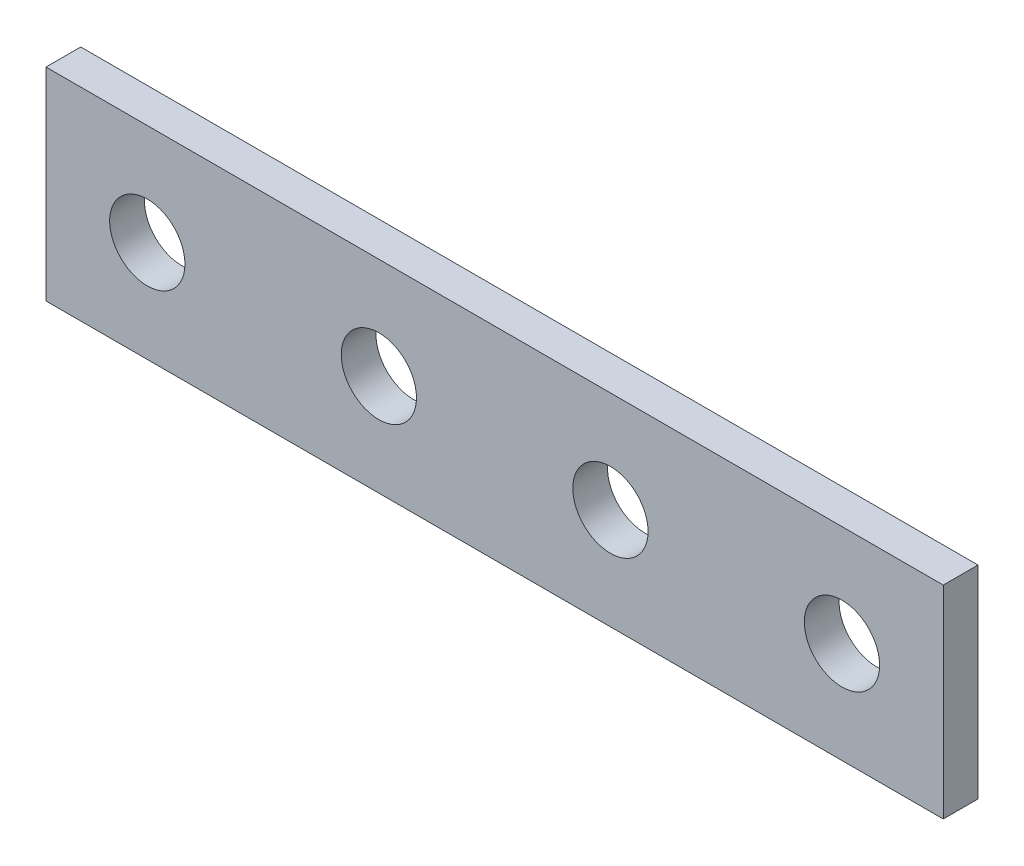
ISO-10303-21;
HEADER;
FILE_DESCRIPTION(('STEP AP214'),'2;1');
FILE_NAME('part.step','',(''),(''),'','','');
FILE_SCHEMA(('AUTOMOTIVE_DESIGN { 1 0 10303 214 1 1 1 1 }'));
ENDSEC;
DATA;
#1=APPLICATION_CONTEXT('core data for automotive mechanical design processes');
#2=APPLICATION_PROTOCOL_DEFINITION('international standard','automotive_design',2000,#1);
#3=PRODUCT_CONTEXT('',#1,'mechanical');
#4=PRODUCT('Part','Part','',(#3));
#5=PRODUCT_RELATED_PRODUCT_CATEGORY('part','',(#4));
#6=PRODUCT_DEFINITION_FORMATION('','',#4);
#7=PRODUCT_DEFINITION_CONTEXT('part definition',#1,'design');
#8=PRODUCT_DEFINITION('design','',#6,#7);
#9=PRODUCT_DEFINITION_SHAPE('','',#8);
#10=(LENGTH_UNIT() NAMED_UNIT(*) SI_UNIT(.MILLI.,.METRE.));
#11=(NAMED_UNIT(*) PLANE_ANGLE_UNIT() SI_UNIT($,.RADIAN.));
#12=(NAMED_UNIT(*) SI_UNIT($,.STERADIAN.) SOLID_ANGLE_UNIT());
#13=UNCERTAINTY_MEASURE_WITH_UNIT(LENGTH_MEASURE(1.E-05),#10,'distance_accuracy_value','');
#14=(GEOMETRIC_REPRESENTATION_CONTEXT(3) GLOBAL_UNCERTAINTY_ASSIGNED_CONTEXT((#13)) GLOBAL_UNIT_ASSIGNED_CONTEXT((#10,
#11,#12)) REPRESENTATION_CONTEXT('',''));
#15=CARTESIAN_POINT('',(0.,0.,0.));
#16=DIRECTION('',(0.,0.,1.));
#17=DIRECTION('',(1.,0.,0.));
#18=AXIS2_PLACEMENT_3D('',#15,#16,#17);
#19=CARTESIAN_POINT('',(0.,0.,12.));
#20=DIRECTION('',(0.,0.,-1.));
#21=DIRECTION('',(-1.,0.,0.));
#22=AXIS2_PLACEMENT_3D('',#19,#20,#21);
#23=PLANE('',#22);
#24=CARTESIAN_POINT('',(195.,35.,12.));
#25=DIRECTION('',(0.,0.,1.));
#26=DIRECTION('',(1.,0.,0.));
#27=AXIS2_PLACEMENT_3D('',#24,#25,#26);
#28=CIRCLE('',#27,13.);
#29=CARTESIAN_POINT('',(208.,35.,12.));
#30=VERTEX_POINT('',#29);
#31=EDGE_CURVE('E120',#30,#30,#28,.T.);
#32=ORIENTED_EDGE('',*,*,#31,.F.);
#33=EDGE_LOOP('',(#32));
#34=FACE_BOUND('',#33,.T.);
#35=CARTESIAN_POINT('',(35.,35.,12.));
#36=DIRECTION('',(0.,0.,1.));
#37=DIRECTION('',(1.,0.,0.));
#38=AXIS2_PLACEMENT_3D('',#35,#36,#37);
#39=CIRCLE('',#38,13.);
#40=CARTESIAN_POINT('',(48.,35.,12.));
#41=VERTEX_POINT('',#40);
#42=EDGE_CURVE('E99',#41,#41,#39,.T.);
#43=ORIENTED_EDGE('',*,*,#42,.F.);
#44=EDGE_LOOP('',(#43));
#45=FACE_BOUND('',#44,.T.);
#46=DIRECTION('',(0.,-1.,0.));
#47=VECTOR('',#46,1.);
#48=CARTESIAN_POINT('',(0.,0.,12.));
#49=LINE('',#48,#47);
#50=CARTESIAN_POINT('',(0.,70.,12.));
#51=VERTEX_POINT('',#50);
#52=CARTESIAN_POINT('',(0.,0.,12.));
#53=VERTEX_POINT('',#52);
#54=EDGE_CURVE('E84',#51,#53,#49,.T.);
#55=ORIENTED_EDGE('',*,*,#54,.T.);
#56=DIRECTION('',(1.,0.,0.));
#57=VECTOR('',#56,1.);
#58=CARTESIAN_POINT('',(0.,0.,12.));
#59=LINE('',#58,#57);
#60=CARTESIAN_POINT('',(310.,0.,12.));
#61=VERTEX_POINT('',#60);
#62=EDGE_CURVE('E79',#53,#61,#59,.T.);
#63=ORIENTED_EDGE('',*,*,#62,.T.);
#64=DIRECTION('',(0.,1.,0.));
#65=VECTOR('',#64,1.);
#66=CARTESIAN_POINT('',(310.,0.,12.));
#67=LINE('',#66,#65);
#68=CARTESIAN_POINT('',(310.,70.,12.));
#69=VERTEX_POINT('',#68);
#70=EDGE_CURVE('E82',#61,#69,#67,.T.);
#71=ORIENTED_EDGE('',*,*,#70,.T.);
#72=DIRECTION('',(-1.,0.,0.));
#73=VECTOR('',#72,1.);
#74=CARTESIAN_POINT('',(0.,70.,12.));
#75=LINE('',#74,#73);
#76=EDGE_CURVE('E49',#69,#51,#75,.T.);
#77=ORIENTED_EDGE('',*,*,#76,.T.);
#78=EDGE_LOOP('',(#55,#63,#71,#77));
#79=FACE_BOUND('',#78,.T.);
#80=CARTESIAN_POINT('',(115.,35.,12.));
#81=DIRECTION('',(0.,0.,1.));
#82=DIRECTION('',(1.,0.,0.));
#83=AXIS2_PLACEMENT_3D('',#80,#81,#82);
#84=CIRCLE('',#83,13.);
#85=CARTESIAN_POINT('',(128.,35.,12.));
#86=VERTEX_POINT('',#85);
#87=EDGE_CURVE('E114',#86,#86,#84,.T.);
#88=ORIENTED_EDGE('',*,*,#87,.F.);
#89=EDGE_LOOP('',(#88));
#90=FACE_BOUND('',#89,.T.);
#91=CARTESIAN_POINT('',(275.,35.,12.));
#92=DIRECTION('',(0.,0.,1.));
#93=DIRECTION('',(1.,0.,0.));
#94=AXIS2_PLACEMENT_3D('',#91,#92,#93);
#95=CIRCLE('',#94,13.);
#96=CARTESIAN_POINT('',(288.,35.,12.));
#97=VERTEX_POINT('',#96);
#98=EDGE_CURVE('E126',#97,#97,#95,.T.);
#99=ORIENTED_EDGE('',*,*,#98,.F.);
#100=EDGE_LOOP('',(#99));
#101=FACE_BOUND('',#100,.T.);
#102=ADVANCED_FACE('F32',(#34,#45,#79,#90,#101),#23,.F.);
#103=CARTESIAN_POINT('',(0.,0.,0.));
#104=DIRECTION('',(0.,0.,-1.));
#105=DIRECTION('',(-1.,0.,0.));
#106=AXIS2_PLACEMENT_3D('',#103,#104,#105);
#107=PLANE('',#106);
#108=CARTESIAN_POINT('',(195.,35.,0.));
#109=DIRECTION('',(0.,0.,1.));
#110=DIRECTION('',(1.,0.,0.));
#111=AXIS2_PLACEMENT_3D('',#108,#109,#110);
#112=CIRCLE('',#111,13.);
#113=CARTESIAN_POINT('',(208.,35.,0.));
#114=VERTEX_POINT('',#113);
#115=EDGE_CURVE('E123',#114,#114,#112,.T.);
#116=ORIENTED_EDGE('',*,*,#115,.T.);
#117=EDGE_LOOP('',(#116));
#118=FACE_BOUND('',#117,.T.);
#119=CARTESIAN_POINT('',(35.,35.,0.));
#120=DIRECTION('',(0.,0.,1.));
#121=DIRECTION('',(1.,0.,0.));
#122=AXIS2_PLACEMENT_3D('',#119,#120,#121);
#123=CIRCLE('',#122,13.);
#124=CARTESIAN_POINT('',(48.,35.,0.));
#125=VERTEX_POINT('',#124);
#126=EDGE_CURVE('E111',#125,#125,#123,.T.);
#127=ORIENTED_EDGE('',*,*,#126,.T.);
#128=EDGE_LOOP('',(#127));
#129=FACE_BOUND('',#128,.T.);
#130=DIRECTION('',(0.,-1.,0.));
#131=VECTOR('',#130,1.);
#132=CARTESIAN_POINT('',(0.,0.,0.));
#133=LINE('',#132,#131);
#134=CARTESIAN_POINT('',(0.,70.,0.));
#135=VERTEX_POINT('',#134);
#136=CARTESIAN_POINT('',(0.,0.,0.));
#137=VERTEX_POINT('',#136);
#138=EDGE_CURVE('E96',#135,#137,#133,.T.);
#139=ORIENTED_EDGE('',*,*,#138,.F.);
#140=DIRECTION('',(-1.,0.,0.));
#141=VECTOR('',#140,1.);
#142=CARTESIAN_POINT('',(0.,70.,0.));
#143=LINE('',#142,#141);
#144=CARTESIAN_POINT('',(310.,70.,0.));
#145=VERTEX_POINT('',#144);
#146=EDGE_CURVE('E72',#145,#135,#143,.T.);
#147=ORIENTED_EDGE('',*,*,#146,.F.);
#148=DIRECTION('',(0.,1.,0.));
#149=VECTOR('',#148,1.);
#150=CARTESIAN_POINT('',(310.,0.,0.));
#151=LINE('',#150,#149);
#152=CARTESIAN_POINT('',(310.,0.,0.));
#153=VERTEX_POINT('',#152);
#154=EDGE_CURVE('E66',#153,#145,#151,.T.);
#155=ORIENTED_EDGE('',*,*,#154,.F.);
#156=DIRECTION('',(1.,0.,0.));
#157=VECTOR('',#156,1.);
#158=CARTESIAN_POINT('',(0.,0.,0.));
#159=LINE('',#158,#157);
#160=EDGE_CURVE('E88',#137,#153,#159,.T.);
#161=ORIENTED_EDGE('',*,*,#160,.F.);
#162=EDGE_LOOP('',(#139,#147,#155,#161));
#163=FACE_BOUND('',#162,.T.);
#164=CARTESIAN_POINT('',(115.,35.,0.));
#165=DIRECTION('',(0.,0.,1.));
#166=DIRECTION('',(1.,0.,0.));
#167=AXIS2_PLACEMENT_3D('',#164,#165,#166);
#168=CIRCLE('',#167,13.);
#169=CARTESIAN_POINT('',(128.,35.,0.));
#170=VERTEX_POINT('',#169);
#171=EDGE_CURVE('E117',#170,#170,#168,.T.);
#172=ORIENTED_EDGE('',*,*,#171,.T.);
#173=EDGE_LOOP('',(#172));
#174=FACE_BOUND('',#173,.T.);
#175=CARTESIAN_POINT('',(275.,35.,0.));
#176=DIRECTION('',(0.,0.,1.));
#177=DIRECTION('',(1.,0.,0.));
#178=AXIS2_PLACEMENT_3D('',#175,#176,#177);
#179=CIRCLE('',#178,13.);
#180=CARTESIAN_POINT('',(288.,35.,0.));
#181=VERTEX_POINT('',#180);
#182=EDGE_CURVE('E129',#181,#181,#179,.T.);
#183=ORIENTED_EDGE('',*,*,#182,.T.);
#184=EDGE_LOOP('',(#183));
#185=FACE_BOUND('',#184,.T.);
#186=ADVANCED_FACE('F107',(#118,#129,#163,#174,#185),#107,.T.);
#187=CARTESIAN_POINT('',(0.,0.,12.));
#188=DIRECTION('',(1.,0.,0.));
#189=DIRECTION('',(0.,0.,-1.));
#190=AXIS2_PLACEMENT_3D('',#187,#188,#189);
#191=PLANE('',#190);
#192=ORIENTED_EDGE('',*,*,#138,.T.);
#193=DIRECTION('',(0.,0.,-1.));
#194=VECTOR('',#193,1.);
#195=CARTESIAN_POINT('',(0.,0.,12.));
#196=LINE('',#195,#194);
#197=EDGE_CURVE('E11',#53,#137,#196,.T.);
#198=ORIENTED_EDGE('',*,*,#197,.F.);
#199=ORIENTED_EDGE('',*,*,#54,.F.);
#200=DIRECTION('',(0.,0.,-1.));
#201=VECTOR('',#200,1.);
#202=CARTESIAN_POINT('',(0.,70.,12.));
#203=LINE('',#202,#201);
#204=EDGE_CURVE('E92',#51,#135,#203,.T.);
#205=ORIENTED_EDGE('',*,*,#204,.T.);
#206=EDGE_LOOP('',(#192,#198,#199,#205));
#207=FACE_BOUND('',#206,.T.);
#208=ADVANCED_FACE('F34',(#207),#191,.F.);
#209=CARTESIAN_POINT('',(0.,0.,12.));
#210=DIRECTION('',(0.,1.,0.));
#211=DIRECTION('',(0.,0.,1.));
#212=AXIS2_PLACEMENT_3D('',#209,#210,#211);
#213=PLANE('',#212);
#214=ORIENTED_EDGE('',*,*,#160,.T.);
#215=DIRECTION('',(0.,0.,-1.));
#216=VECTOR('',#215,1.);
#217=CARTESIAN_POINT('',(310.,0.,12.));
#218=LINE('',#217,#216);
#219=EDGE_CURVE('E41',#61,#153,#218,.T.);
#220=ORIENTED_EDGE('',*,*,#219,.F.);
#221=ORIENTED_EDGE('',*,*,#62,.F.);
#222=ORIENTED_EDGE('',*,*,#197,.T.);
#223=EDGE_LOOP('',(#214,#220,#221,#222));
#224=FACE_BOUND('',#223,.T.);
#225=ADVANCED_FACE('F87',(#224),#213,.F.);
#226=CARTESIAN_POINT('',(310.,0.,12.));
#227=DIRECTION('',(-1.,0.,0.));
#228=DIRECTION('',(0.,0.,1.));
#229=AXIS2_PLACEMENT_3D('',#226,#227,#228);
#230=PLANE('',#229);
#231=ORIENTED_EDGE('',*,*,#154,.T.);
#232=DIRECTION('',(0.,0.,-1.));
#233=VECTOR('',#232,1.);
#234=CARTESIAN_POINT('',(310.,70.,12.));
#235=LINE('',#234,#233);
#236=EDGE_CURVE('E89',#69,#145,#235,.T.);
#237=ORIENTED_EDGE('',*,*,#236,.F.);
#238=ORIENTED_EDGE('',*,*,#70,.F.);
#239=ORIENTED_EDGE('',*,*,#219,.T.);
#240=EDGE_LOOP('',(#231,#237,#238,#239));
#241=FACE_BOUND('',#240,.T.);
#242=ADVANCED_FACE('F90',(#241),#230,.F.);
#243=CARTESIAN_POINT('',(0.,70.,12.));
#244=DIRECTION('',(0.,-1.,0.));
#245=DIRECTION('',(0.,0.,-1.));
#246=AXIS2_PLACEMENT_3D('',#243,#244,#245);
#247=PLANE('',#246);
#248=ORIENTED_EDGE('',*,*,#146,.T.);
#249=ORIENTED_EDGE('',*,*,#204,.F.);
#250=ORIENTED_EDGE('',*,*,#76,.F.);
#251=ORIENTED_EDGE('',*,*,#236,.T.);
#252=EDGE_LOOP('',(#248,#249,#250,#251));
#253=FACE_BOUND('',#252,.T.);
#254=ADVANCED_FACE('F104',(#253),#247,.F.);
#255=CARTESIAN_POINT('',(35.,35.,12.));
#256=DIRECTION('',(0.,0.,-1.));
#257=DIRECTION('',(-1.,0.,0.));
#258=AXIS2_PLACEMENT_3D('',#255,#256,#257);
#259=CYLINDRICAL_SURFACE('',#258,13.);
#260=ORIENTED_EDGE('',*,*,#42,.T.);
#261=EDGE_LOOP('',(#260));
#262=FACE_BOUND('',#261,.T.);
#263=ORIENTED_EDGE('',*,*,#126,.F.);
#264=EDGE_LOOP('',(#263));
#265=FACE_BOUND('',#264,.T.);
#266=ADVANCED_FACE('F149',(#262,#265),#259,.F.);
#267=CARTESIAN_POINT('',(115.,35.,12.));
#268=DIRECTION('',(0.,0.,-1.));
#269=DIRECTION('',(-1.,0.,0.));
#270=AXIS2_PLACEMENT_3D('',#267,#268,#269);
#271=CYLINDRICAL_SURFACE('',#270,13.);
#272=ORIENTED_EDGE('',*,*,#87,.T.);
#273=EDGE_LOOP('',(#272));
#274=FACE_BOUND('',#273,.T.);
#275=ORIENTED_EDGE('',*,*,#171,.F.);
#276=EDGE_LOOP('',(#275));
#277=FACE_BOUND('',#276,.T.);
#278=ADVANCED_FACE('F195',(#274,#277),#271,.F.);
#279=CARTESIAN_POINT('',(195.,35.,12.));
#280=DIRECTION('',(0.,0.,-1.));
#281=DIRECTION('',(-1.,0.,0.));
#282=AXIS2_PLACEMENT_3D('',#279,#280,#281);
#283=CYLINDRICAL_SURFACE('',#282,13.);
#284=ORIENTED_EDGE('',*,*,#31,.T.);
#285=EDGE_LOOP('',(#284));
#286=FACE_BOUND('',#285,.T.);
#287=ORIENTED_EDGE('',*,*,#115,.F.);
#288=EDGE_LOOP('',(#287));
#289=FACE_BOUND('',#288,.T.);
#290=ADVANCED_FACE('F203',(#286,#289),#283,.F.);
#291=CARTESIAN_POINT('',(275.,35.,12.));
#292=DIRECTION('',(0.,0.,-1.));
#293=DIRECTION('',(-1.,0.,0.));
#294=AXIS2_PLACEMENT_3D('',#291,#292,#293);
#295=CYLINDRICAL_SURFACE('',#294,13.);
#296=ORIENTED_EDGE('',*,*,#98,.T.);
#297=EDGE_LOOP('',(#296));
#298=FACE_BOUND('',#297,.T.);
#299=ORIENTED_EDGE('',*,*,#182,.F.);
#300=EDGE_LOOP('',(#299));
#301=FACE_BOUND('',#300,.T.);
#302=ADVANCED_FACE('F135',(#298,#301),#295,.F.);
#303=CLOSED_SHELL('',(#102,#186,#208,#225,#242,#254,#266,#278,#290,#302));
#304=MANIFOLD_SOLID_BREP('B2',#303);
#305=ADVANCED_BREP_SHAPE_REPRESENTATION('',(#18,#304),#14);
#306=SHAPE_DEFINITION_REPRESENTATION(#9,#305);
ENDSEC;
END-ISO-10303-21;
